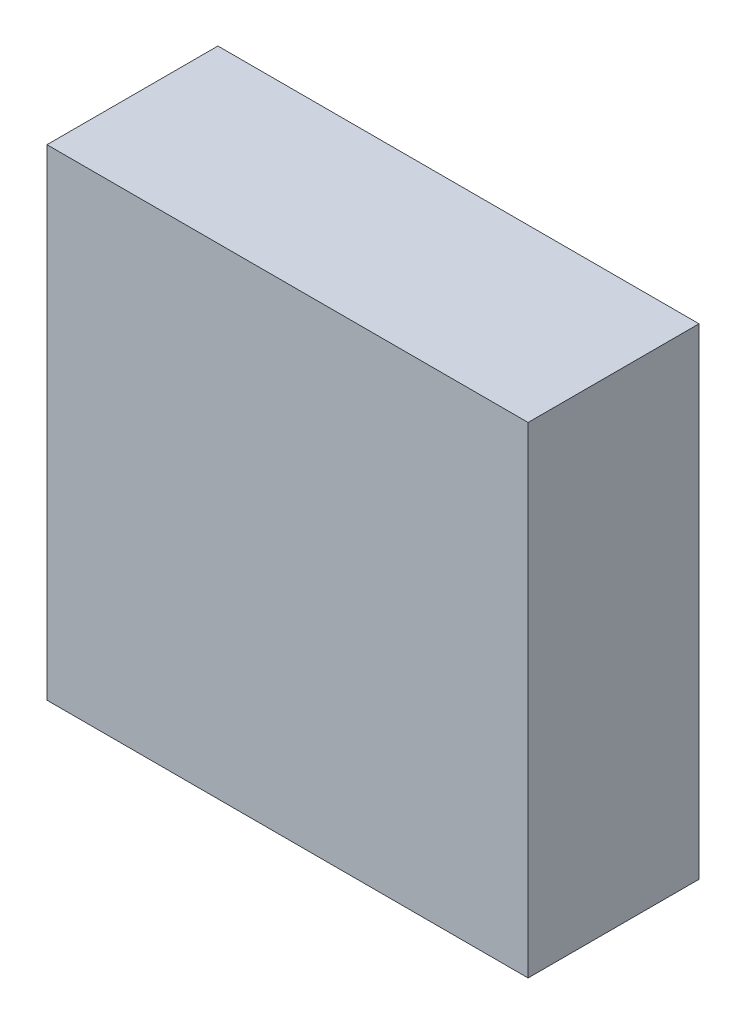
ISO-10303-21;
HEADER;
FILE_DESCRIPTION(('STEP AP214'),'2;1');
FILE_NAME('part.step','',(''),(''),'','','');
FILE_SCHEMA(('AUTOMOTIVE_DESIGN { 1 0 10303 214 1 1 1 1 }'));
ENDSEC;
DATA;
#1=APPLICATION_CONTEXT('core data for automotive mechanical design processes');
#2=APPLICATION_PROTOCOL_DEFINITION('international standard','automotive_design',2000,#1);
#3=PRODUCT_CONTEXT('',#1,'mechanical');
#4=PRODUCT('Part','Part','',(#3));
#5=PRODUCT_RELATED_PRODUCT_CATEGORY('part','',(#4));
#6=PRODUCT_DEFINITION_FORMATION('','',#4);
#7=PRODUCT_DEFINITION_CONTEXT('part definition',#1,'design');
#8=PRODUCT_DEFINITION('design','',#6,#7);
#9=PRODUCT_DEFINITION_SHAPE('','',#8);
#10=(LENGTH_UNIT() NAMED_UNIT(*) SI_UNIT(.MILLI.,.METRE.));
#11=(NAMED_UNIT(*) PLANE_ANGLE_UNIT() SI_UNIT($,.RADIAN.));
#12=(NAMED_UNIT(*) SI_UNIT($,.STERADIAN.) SOLID_ANGLE_UNIT());
#13=UNCERTAINTY_MEASURE_WITH_UNIT(LENGTH_MEASURE(1.E-05),#10,'distance_accuracy_value','');
#14=(GEOMETRIC_REPRESENTATION_CONTEXT(3) GLOBAL_UNCERTAINTY_ASSIGNED_CONTEXT((#13)) GLOBAL_UNIT_ASSIGNED_CONTEXT((#10,
#11,#12)) REPRESENTATION_CONTEXT('',''));
#15=CARTESIAN_POINT('',(0.,0.,0.));
#16=DIRECTION('',(0.,0.,1.));
#17=DIRECTION('',(1.,0.,0.));
#18=AXIS2_PLACEMENT_3D('',#15,#16,#17);
#19=CARTESIAN_POINT('',(22.165500488281,26.0375,-0.598600000381));
#20=DIRECTION('',(0.,0.,-1.));
#21=DIRECTION('',(0.,-1.,0.));
#22=AXIS2_PLACEMENT_3D('',#19,#20,#21);
#23=PLANE('',#22);
#24=CARTESIAN_POINT('',(22.165500488281,26.0375,-0.598600000381));
#25=DIRECTION('',(0.,0.,-1.));
#26=DIRECTION('',(1.,0.,0.));
#27=AXIS2_PLACEMENT_3D('',#24,#25,#26);
#28=CIRCLE('',#27,0.07125);
#29=CARTESIAN_POINT('',(22.236750488281,26.0375,-0.598600000381));
#30=VERTEX_POINT('',#29);
#31=CARTESIAN_POINT('',(22.094250488281,26.0375,-0.598600000381));
#32=VERTEX_POINT('',#31);
#33=EDGE_CURVE('E72',#30,#32,#28,.T.);
#34=ORIENTED_EDGE('',*,*,#33,.T.);
#35=CARTESIAN_POINT('',(22.165500488281,26.0375,-0.598600000381));
#36=DIRECTION('',(0.,0.,-1.));
#37=DIRECTION('',(1.,0.,0.));
#38=AXIS2_PLACEMENT_3D('',#35,#36,#37);
#39=CIRCLE('',#38,0.07125);
#40=EDGE_CURVE('E11',#32,#30,#39,.T.);
#41=ORIENTED_EDGE('',*,*,#40,.T.);
#42=EDGE_LOOP('',(#34,#41));
#43=FACE_BOUND('',#42,.T.);
#44=ADVANCED_FACE('F17',(#43),#23,.T.);
#45=CARTESIAN_POINT('',(22.165500488281,26.0375,-0.598600000381));
#46=DIRECTION('',(0.,0.,1.));
#47=DIRECTION('',(1.,0.,0.));
#48=AXIS2_PLACEMENT_3D('',#45,#46,#47);
#49=CYLINDRICAL_SURFACE('',#48,0.07125);
#50=DIRECTION('',(0.,0.,1.));
#51=VECTOR('',#50,1.);
#52=CARTESIAN_POINT('',(22.094250488281,26.0375,-0.598600000381));
#53=LINE('',#52,#51);
#54=CARTESIAN_POINT('',(22.094250488281,26.0375,-0.664600000381));
#55=VERTEX_POINT('',#54);
#56=EDGE_CURVE('E66',#55,#32,#53,.T.);
#57=ORIENTED_EDGE('',*,*,#56,.F.);
#58=CARTESIAN_POINT('',(22.165500488281,26.0375,-0.664600000381));
#59=DIRECTION('',(0.,0.,1.));
#60=DIRECTION('',(1.,0.,0.));
#61=AXIS2_PLACEMENT_3D('',#58,#59,#60);
#62=CIRCLE('',#61,0.07125);
#63=CARTESIAN_POINT('',(22.236750488281,26.0375,-0.664600000381));
#64=VERTEX_POINT('',#63);
#65=EDGE_CURVE('E28',#64,#55,#62,.T.);
#66=ORIENTED_EDGE('',*,*,#65,.F.);
#67=DIRECTION('',(0.,0.,1.));
#68=VECTOR('',#67,1.);
#69=CARTESIAN_POINT('',(22.236750488281,26.0375,-0.598600000381));
#70=LINE('',#69,#68);
#71=EDGE_CURVE('E69',#64,#30,#70,.T.);
#72=ORIENTED_EDGE('',*,*,#71,.T.);
#73=ORIENTED_EDGE('',*,*,#40,.F.);
#74=EDGE_LOOP('',(#57,#66,#72,#73));
#75=FACE_BOUND('',#74,.T.);
#76=ADVANCED_FACE('F64',(#75),#49,.F.);
#77=CARTESIAN_POINT('',(22.308000488281,25.04,-0.664600000381));
#78=DIRECTION('',(0.,0.,-1.));
#79=DIRECTION('',(0.,-1.,0.));
#80=AXIS2_PLACEMENT_3D('',#77,#78,#79);
#81=PLANE('',#80);
#82=ORIENTED_EDGE('',*,*,#65,.T.);
#83=CARTESIAN_POINT('',(22.165500488281,26.0375,-0.664600000381));
#84=DIRECTION('',(0.,0.,1.));
#85=DIRECTION('',(1.,0.,0.));
#86=AXIS2_PLACEMENT_3D('',#83,#84,#85);
#87=CIRCLE('',#86,0.07125);
#88=EDGE_CURVE('E78',#55,#64,#87,.T.);
#89=ORIENTED_EDGE('',*,*,#88,.T.);
#90=EDGE_LOOP('',(#82,#89));
#91=FACE_BOUND('',#90,.T.);
#92=DIRECTION('',(0.,-1.,0.));
#93=VECTOR('',#92,1.);
#94=CARTESIAN_POINT('',(21.168000488281,25.04,-0.664600000381));
#95=LINE('',#94,#93);
#96=CARTESIAN_POINT('',(21.168000488281,26.18,-0.664600000381));
#97=VERTEX_POINT('',#96);
#98=CARTESIAN_POINT('',(21.168000488281,25.04,-0.664600000381));
#99=VERTEX_POINT('',#98);
#100=EDGE_CURVE('E92',#97,#99,#95,.T.);
#101=ORIENTED_EDGE('',*,*,#100,.F.);
#102=DIRECTION('',(-1.,0.,0.));
#103=VECTOR('',#102,1.);
#104=CARTESIAN_POINT('',(22.308000488281,26.18,-0.664600000381));
#105=LINE('',#104,#103);
#106=CARTESIAN_POINT('',(22.308000488281,26.18,-0.664600000381));
#107=VERTEX_POINT('',#106);
#108=EDGE_CURVE('E115',#107,#97,#105,.T.);
#109=ORIENTED_EDGE('',*,*,#108,.F.);
#110=DIRECTION('',(0.,-1.,0.));
#111=VECTOR('',#110,1.);
#112=CARTESIAN_POINT('',(22.308000488281,25.04,-0.664600000381));
#113=LINE('',#112,#111);
#114=CARTESIAN_POINT('',(22.308000488281,25.04,-0.664600000381));
#115=VERTEX_POINT('',#114);
#116=EDGE_CURVE('E21',#107,#115,#113,.T.);
#117=ORIENTED_EDGE('',*,*,#116,.T.);
#118=DIRECTION('',(-1.,0.,0.));
#119=VECTOR('',#118,1.);
#120=CARTESIAN_POINT('',(22.308000488281,25.04,-0.664600000381));
#121=LINE('',#120,#119);
#122=EDGE_CURVE('E91',#115,#99,#121,.T.);
#123=ORIENTED_EDGE('',*,*,#122,.T.);
#124=EDGE_LOOP('',(#101,#109,#117,#123));
#125=FACE_BOUND('',#124,.T.);
#126=ADVANCED_FACE('F175',(#91,#125),#81,.T.);
#127=CARTESIAN_POINT('',(22.308000488281,25.04,-0.259600000381));
#128=DIRECTION('',(-1.,0.,0.));
#129=DIRECTION('',(0.,1.,0.));
#130=AXIS2_PLACEMENT_3D('',#127,#128,#129);
#131=PLANE('',#130);
#132=DIRECTION('',(0.,0.,-1.));
#133=VECTOR('',#132,1.);
#134=CARTESIAN_POINT('',(22.308000488281,26.18,-0.259600000381));
#135=LINE('',#134,#133);
#136=CARTESIAN_POINT('',(22.308000488281,26.18,-0.259600000381));
#137=VERTEX_POINT('',#136);
#138=EDGE_CURVE('E103',#137,#107,#135,.T.);
#139=ORIENTED_EDGE('',*,*,#138,.F.);
#140=DIRECTION('',(0.,-1.,0.));
#141=VECTOR('',#140,1.);
#142=CARTESIAN_POINT('',(22.308000488281,25.04,-0.259600000381));
#143=LINE('',#142,#141);
#144=CARTESIAN_POINT('',(22.308000488281,25.04,-0.259600000381));
#145=VERTEX_POINT('',#144);
#146=EDGE_CURVE('E120',#137,#145,#143,.T.);
#147=ORIENTED_EDGE('',*,*,#146,.T.);
#148=DIRECTION('',(0.,0.,-1.));
#149=VECTOR('',#148,1.);
#150=CARTESIAN_POINT('',(22.308000488281,25.04,-0.259600000381));
#151=LINE('',#150,#149);
#152=EDGE_CURVE('E87',#145,#115,#151,.T.);
#153=ORIENTED_EDGE('',*,*,#152,.T.);
#154=ORIENTED_EDGE('',*,*,#116,.F.);
#155=EDGE_LOOP('',(#139,#147,#153,#154));
#156=FACE_BOUND('',#155,.T.);
#157=ADVANCED_FACE('F225',(#156),#131,.F.);
#158=CARTESIAN_POINT('',(22.308000488281,25.04,-0.259600000381));
#159=DIRECTION('',(0.,1.,0.));
#160=DIRECTION('',(1.,0.,0.));
#161=AXIS2_PLACEMENT_3D('',#158,#159,#160);
#162=PLANE('',#161);
#163=ORIENTED_EDGE('',*,*,#122,.F.);
#164=ORIENTED_EDGE('',*,*,#152,.F.);
#165=DIRECTION('',(-1.,0.,0.));
#166=VECTOR('',#165,1.);
#167=CARTESIAN_POINT('',(22.308000488281,25.04,-0.259600000381));
#168=LINE('',#167,#166);
#169=CARTESIAN_POINT('',(21.168000488281,25.04,-0.259600000381));
#170=VERTEX_POINT('',#169);
#171=EDGE_CURVE('E133',#145,#170,#168,.T.);
#172=ORIENTED_EDGE('',*,*,#171,.T.);
#173=DIRECTION('',(0.,0.,1.));
#174=VECTOR('',#173,1.);
#175=CARTESIAN_POINT('',(21.168000488281,25.04,-0.259600000381));
#176=LINE('',#175,#174);
#177=EDGE_CURVE('E88',#99,#170,#176,.T.);
#178=ORIENTED_EDGE('',*,*,#177,.F.);
#179=EDGE_LOOP('',(#163,#164,#172,#178));
#180=FACE_BOUND('',#179,.T.);
#181=ADVANCED_FACE('F150',(#180),#162,.F.);
#182=CARTESIAN_POINT('',(21.168000488281,25.04,-0.259600000381));
#183=DIRECTION('',(-1.,0.,0.));
#184=DIRECTION('',(0.,1.,0.));
#185=AXIS2_PLACEMENT_3D('',#182,#183,#184);
#186=PLANE('',#185);
#187=DIRECTION('',(0.,0.,1.));
#188=VECTOR('',#187,1.);
#189=CARTESIAN_POINT('',(21.168000488281,26.18,-0.259600000381));
#190=LINE('',#189,#188);
#191=CARTESIAN_POINT('',(21.168000488281,26.18,-0.259600000381));
#192=VERTEX_POINT('',#191);
#193=EDGE_CURVE('E111',#97,#192,#190,.T.);
#194=ORIENTED_EDGE('',*,*,#193,.F.);
#195=ORIENTED_EDGE('',*,*,#100,.T.);
#196=ORIENTED_EDGE('',*,*,#177,.T.);
#197=DIRECTION('',(0.,1.,0.));
#198=VECTOR('',#197,1.);
#199=CARTESIAN_POINT('',(21.168000488281,25.04,-0.259600000381));
#200=LINE('',#199,#198);
#201=EDGE_CURVE('E123',#170,#192,#200,.T.);
#202=ORIENTED_EDGE('',*,*,#201,.T.);
#203=EDGE_LOOP('',(#194,#195,#196,#202));
#204=FACE_BOUND('',#203,.T.);
#205=ADVANCED_FACE('F156',(#204),#186,.T.);
#206=CARTESIAN_POINT('',(22.308000488281,26.18,-0.259600000381));
#207=DIRECTION('',(0.,1.,0.));
#208=DIRECTION('',(1.,0.,0.));
#209=AXIS2_PLACEMENT_3D('',#206,#207,#208);
#210=PLANE('',#209);
#211=ORIENTED_EDGE('',*,*,#108,.T.);
#212=ORIENTED_EDGE('',*,*,#193,.T.);
#213=DIRECTION('',(1.,0.,0.));
#214=VECTOR('',#213,1.);
#215=CARTESIAN_POINT('',(22.308000488281,26.18,-0.259600000381));
#216=LINE('',#215,#214);
#217=EDGE_CURVE('E117',#192,#137,#216,.T.);
#218=ORIENTED_EDGE('',*,*,#217,.T.);
#219=ORIENTED_EDGE('',*,*,#138,.T.);
#220=EDGE_LOOP('',(#211,#212,#218,#219));
#221=FACE_BOUND('',#220,.T.);
#222=ADVANCED_FACE('F19',(#221),#210,.T.);
#223=CARTESIAN_POINT('',(22.308000488281,25.04,-0.259600000381));
#224=DIRECTION('',(0.,0.,-1.));
#225=DIRECTION('',(0.,-1.,0.));
#226=AXIS2_PLACEMENT_3D('',#223,#224,#225);
#227=PLANE('',#226);
#228=ORIENTED_EDGE('',*,*,#201,.F.);
#229=ORIENTED_EDGE('',*,*,#171,.F.);
#230=ORIENTED_EDGE('',*,*,#146,.F.);
#231=ORIENTED_EDGE('',*,*,#217,.F.);
#232=EDGE_LOOP('',(#228,#229,#230,#231));
#233=FACE_BOUND('',#232,.T.);
#234=ADVANCED_FACE('F155',(#233),#227,.F.);
#235=CARTESIAN_POINT('',(22.165500488281,26.0375,-0.598600000381));
#236=DIRECTION('',(0.,0.,1.));
#237=DIRECTION('',(1.,0.,0.));
#238=AXIS2_PLACEMENT_3D('',#235,#236,#237);
#239=CYLINDRICAL_SURFACE('',#238,0.07125);
#240=ORIENTED_EDGE('',*,*,#88,.F.);
#241=ORIENTED_EDGE('',*,*,#56,.T.);
#242=ORIENTED_EDGE('',*,*,#33,.F.);
#243=ORIENTED_EDGE('',*,*,#71,.F.);
#244=EDGE_LOOP('',(#240,#241,#242,#243));
#245=FACE_BOUND('',#244,.T.);
#246=ADVANCED_FACE('F76',(#245),#239,.F.);
#247=CLOSED_SHELL('',(#44,#76,#126,#157,#181,#205,#222,#234,#246));
#248=MANIFOLD_SOLID_BREP('B1',#247);
#249=ADVANCED_BREP_SHAPE_REPRESENTATION('',(#18,#248),#14);
#250=SHAPE_DEFINITION_REPRESENTATION(#9,#249);
ENDSEC;
END-ISO-10303-21;
